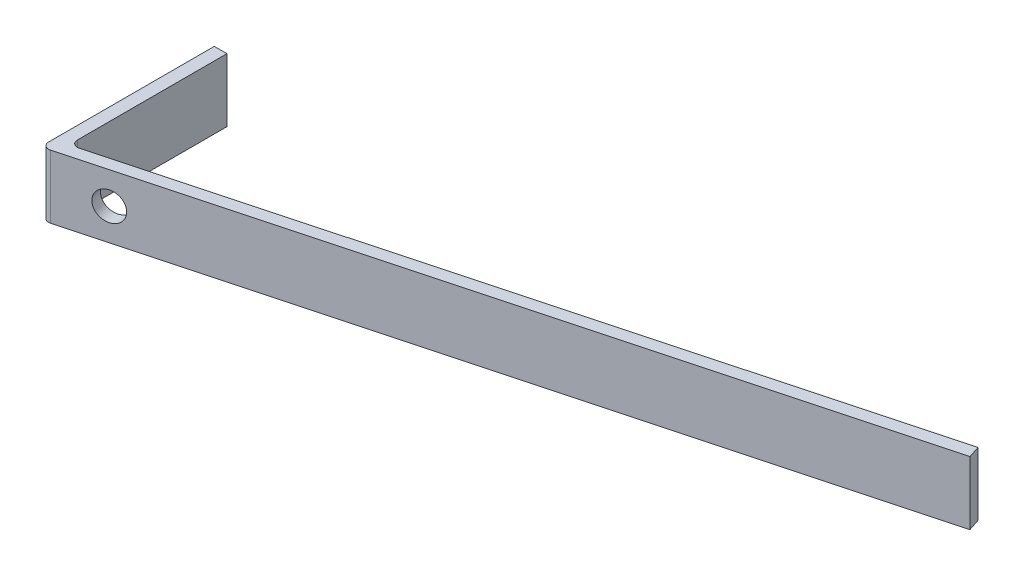
ISO-10303-21;
HEADER;
FILE_DESCRIPTION(('STEP AP214'),'2;1');
FILE_NAME('part.step','',(''),(''),'','','');
FILE_SCHEMA(('AUTOMOTIVE_DESIGN { 1 0 10303 214 1 1 1 1 }'));
ENDSEC;
DATA;
#1=APPLICATION_CONTEXT('core data for automotive mechanical design processes');
#2=APPLICATION_PROTOCOL_DEFINITION('international standard','automotive_design',2000,#1);
#3=PRODUCT_CONTEXT('',#1,'mechanical');
#4=PRODUCT('Part','Part','',(#3));
#5=PRODUCT_RELATED_PRODUCT_CATEGORY('part','',(#4));
#6=PRODUCT_DEFINITION_FORMATION('','',#4);
#7=PRODUCT_DEFINITION_CONTEXT('part definition',#1,'design');
#8=PRODUCT_DEFINITION('design','',#6,#7);
#9=PRODUCT_DEFINITION_SHAPE('','',#8);
#10=(LENGTH_UNIT() NAMED_UNIT(*) SI_UNIT(.MILLI.,.METRE.));
#11=(NAMED_UNIT(*) PLANE_ANGLE_UNIT() SI_UNIT($,.RADIAN.));
#12=(NAMED_UNIT(*) SI_UNIT($,.STERADIAN.) SOLID_ANGLE_UNIT());
#13=UNCERTAINTY_MEASURE_WITH_UNIT(LENGTH_MEASURE(1.E-05),#10,'distance_accuracy_value','');
#14=(GEOMETRIC_REPRESENTATION_CONTEXT(3) GLOBAL_UNCERTAINTY_ASSIGNED_CONTEXT((#13)) GLOBAL_UNIT_ASSIGNED_CONTEXT((#10,
#11,#12)) REPRESENTATION_CONTEXT('',''));
#15=CARTESIAN_POINT('',(0.,0.,0.));
#16=DIRECTION('',(0.,0.,1.));
#17=DIRECTION('',(1.,0.,0.));
#18=AXIS2_PLACEMENT_3D('',#15,#16,#17);
#19=CARTESIAN_POINT('',(0.,10.,0.));
#20=DIRECTION('',(1.,0.,0.));
#21=DIRECTION('',(0.,0.,-1.));
#22=AXIS2_PLACEMENT_3D('',#19,#20,#21);
#23=PLANE('',#22);
#24=DIRECTION('',(0.,0.,1.));
#25=VECTOR('',#24,1.);
#26=CARTESIAN_POINT('',(0.,0.,0.));
#27=LINE('',#26,#25);
#28=CARTESIAN_POINT('',(0.,0.,-27.5));
#29=VERTEX_POINT('',#28);
#30=CARTESIAN_POINT('',(0.,0.,-1.3032253728412));
#31=VERTEX_POINT('',#30);
#32=EDGE_CURVE('E123',#29,#31,#27,.T.);
#33=ORIENTED_EDGE('',*,*,#32,.T.);
#34=DIRECTION('',(0.,-1.,0.));
#35=VECTOR('',#34,1.);
#36=CARTESIAN_POINT('',(0.,10.,-1.3032253728412));
#37=LINE('',#36,#35);
#38=CARTESIAN_POINT('',(0.,10.,-1.3032253728412));
#39=VERTEX_POINT('',#38);
#40=EDGE_CURVE('E151',#31,#39,#37,.F.);
#41=ORIENTED_EDGE('',*,*,#40,.T.);
#42=DIRECTION('',(0.,0.,1.));
#43=VECTOR('',#42,1.);
#44=CARTESIAN_POINT('',(0.,10.,0.));
#45=LINE('',#44,#43);
#46=CARTESIAN_POINT('',(0.,10.,-27.5));
#47=VERTEX_POINT('',#46);
#48=EDGE_CURVE('E125',#47,#39,#45,.T.);
#49=ORIENTED_EDGE('',*,*,#48,.F.);
#50=DIRECTION('',(0.,-1.,0.));
#51=VECTOR('',#50,1.);
#52=CARTESIAN_POINT('',(0.,10.,-27.5));
#53=LINE('',#52,#51);
#54=EDGE_CURVE('E133',#47,#29,#53,.T.);
#55=ORIENTED_EDGE('',*,*,#54,.T.);
#56=EDGE_LOOP('',(#33,#41,#49,#55));
#57=FACE_BOUND('',#56,.T.);
#58=ADVANCED_FACE('F33',(#57),#23,.F.);
#59=CARTESIAN_POINT('',(0.,10.,0.));
#60=DIRECTION('',(-0.258819045102518,0.,-0.965925826289069));
#61=DIRECTION('',(-0.965925826289069,0.,0.258819045102518));
#62=AXIS2_PLACEMENT_3D('',#59,#60,#61);
#63=PLANE('',#62);
#64=CARTESIAN_POINT('',(8.59046727350434,5.,-2.30180876854145));
#65=DIRECTION('',(-0.258819045102518,0.,-0.965925826289069));
#66=DIRECTION('',(-0.965925826289069,0.,0.258819045102518));
#67=AXIS2_PLACEMENT_3D('',#64,#65,#66);
#68=ELLIPSE('',#67,2.25000033349179,2.25);
#69=CARTESIAN_POINT('',(6.41713384222561,5.,-1.71946583074676));
#70=VERTEX_POINT('',#69);
#71=EDGE_CURVE('E121',#70,#70,#68,.T.);
#72=ORIENTED_EDGE('',*,*,#71,.T.);
#73=EDGE_LOOP('',(#72));
#74=FACE_BOUND('',#73,.T.);
#75=DIRECTION('',(0.965925826289069,0.,-0.258819045102518));
#76=VECTOR('',#75,1.);
#77=CARTESIAN_POINT('',(0.,10.,0.));
#78=LINE('',#77,#76);
#79=CARTESIAN_POINT('',(1.25881904510252,10.,-0.337299546552133));
#80=VERTEX_POINT('',#79);
#81=CARTESIAN_POINT('',(115.911099154688,10.,-31.0582854123021));
#82=VERTEX_POINT('',#81);
#83=EDGE_CURVE('E114',#80,#82,#78,.T.);
#84=ORIENTED_EDGE('',*,*,#83,.F.);
#85=DIRECTION('',(0.,-1.,0.));
#86=VECTOR('',#85,1.);
#87=CARTESIAN_POINT('',(1.25881904510252,10.,-0.337299546552133));
#88=LINE('',#87,#86);
#89=CARTESIAN_POINT('',(1.25881904510252,0.,-0.337299546552133));
#90=VERTEX_POINT('',#89);
#91=EDGE_CURVE('E146',#80,#90,#88,.T.);
#92=ORIENTED_EDGE('',*,*,#91,.T.);
#93=DIRECTION('',(0.965925826289069,0.,-0.258819045102518));
#94=VECTOR('',#93,1.);
#95=CARTESIAN_POINT('',(0.,0.,0.));
#96=LINE('',#95,#94);
#97=CARTESIAN_POINT('',(115.911099154688,0.,-31.0582854123021));
#98=VERTEX_POINT('',#97);
#99=EDGE_CURVE('E136',#90,#98,#96,.T.);
#100=ORIENTED_EDGE('',*,*,#99,.T.);
#101=DIRECTION('',(0.,-1.,0.));
#102=VECTOR('',#101,1.);
#103=CARTESIAN_POINT('',(115.911099154688,10.,-31.0582854123021));
#104=LINE('',#103,#102);
#105=EDGE_CURVE('E109',#82,#98,#104,.T.);
#106=ORIENTED_EDGE('',*,*,#105,.F.);
#107=EDGE_LOOP('',(#84,#92,#100,#106));
#108=FACE_BOUND('',#107,.T.);
#109=ADVANCED_FACE('F181',(#74,#108),#63,.F.);
#110=CARTESIAN_POINT('',(2.,10.,-0.535898384862239));
#111=DIRECTION('',(-1.,0.,0.));
#112=DIRECTION('',(0.,0.,1.));
#113=AXIS2_PLACEMENT_3D('',#110,#111,#112);
#114=PLANE('',#113);
#115=DIRECTION('',(0.,0.,-1.));
#116=VECTOR('',#115,1.);
#117=CARTESIAN_POINT('',(2.,10.,-0.535898384862239));
#118=LINE('',#117,#116);
#119=CARTESIAN_POINT('',(2.,10.,-3.84102587555032));
#120=VERTEX_POINT('',#119);
#121=CARTESIAN_POINT('',(2.,10.,-27.5));
#122=VERTEX_POINT('',#121);
#123=EDGE_CURVE('E129',#120,#122,#118,.T.);
#124=ORIENTED_EDGE('',*,*,#123,.F.);
#125=DIRECTION('',(0.,-1.,0.));
#126=VECTOR('',#125,1.);
#127=CARTESIAN_POINT('',(2.,10.,-3.84102587555032));
#128=LINE('',#127,#126);
#129=CARTESIAN_POINT('',(2.,0.,-3.84102587555032));
#130=VERTEX_POINT('',#129);
#131=EDGE_CURVE('E155',#120,#130,#128,.T.);
#132=ORIENTED_EDGE('',*,*,#131,.T.);
#133=DIRECTION('',(0.,0.,-1.));
#134=VECTOR('',#133,1.);
#135=CARTESIAN_POINT('',(2.,0.,-0.535898384862239));
#136=LINE('',#135,#134);
#137=CARTESIAN_POINT('',(2.,0.,-27.5));
#138=VERTEX_POINT('',#137);
#139=EDGE_CURVE('E138',#130,#138,#136,.T.);
#140=ORIENTED_EDGE('',*,*,#139,.T.);
#141=DIRECTION('',(0.,-1.,0.));
#142=VECTOR('',#141,1.);
#143=CARTESIAN_POINT('',(2.,10.,-27.5));
#144=LINE('',#143,#142);
#145=EDGE_CURVE('E143',#122,#138,#144,.T.);
#146=ORIENTED_EDGE('',*,*,#145,.F.);
#147=EDGE_LOOP('',(#124,#132,#140,#146));
#148=FACE_BOUND('',#147,.T.);
#149=ADVANCED_FACE('F166',(#148),#114,.F.);
#150=CARTESIAN_POINT('',(0.,10.,-27.5));
#151=DIRECTION('',(0.,0.,1.));
#152=DIRECTION('',(1.,0.,0.));
#153=AXIS2_PLACEMENT_3D('',#150,#151,#152);
#154=PLANE('',#153);
#155=DIRECTION('',(-1.,0.,0.));
#156=VECTOR('',#155,1.);
#157=CARTESIAN_POINT('',(0.,0.,-27.5));
#158=LINE('',#157,#156);
#159=EDGE_CURVE('E127',#138,#29,#158,.T.);
#160=ORIENTED_EDGE('',*,*,#159,.T.);
#161=ORIENTED_EDGE('',*,*,#54,.F.);
#162=DIRECTION('',(-1.,0.,0.));
#163=VECTOR('',#162,1.);
#164=CARTESIAN_POINT('',(0.,10.,-27.5));
#165=LINE('',#164,#163);
#166=EDGE_CURVE('E131',#122,#47,#165,.T.);
#167=ORIENTED_EDGE('',*,*,#166,.F.);
#168=ORIENTED_EDGE('',*,*,#145,.T.);
#169=EDGE_LOOP('',(#160,#161,#167,#168));
#170=FACE_BOUND('',#169,.T.);
#171=ADVANCED_FACE('F173',(#170),#154,.F.);
#172=CARTESIAN_POINT('',(0.,10.,0.));
#173=DIRECTION('',(0.,-1.,0.));
#174=DIRECTION('',(0.,0.,-1.));
#175=AXIS2_PLACEMENT_3D('',#172,#173,#174);
#176=PLANE('',#175);
#177=ORIENTED_EDGE('',*,*,#48,.T.);
#178=CARTESIAN_POINT('',(1.,10.,-1.3032253728412));
#179=DIRECTION('',(0.,-1.,0.));
#180=DIRECTION('',(0.,0.,-1.));
#181=AXIS2_PLACEMENT_3D('',#178,#179,#180);
#182=CIRCLE('',#181,1.);
#183=EDGE_CURVE('E153',#39,#80,#182,.F.);
#184=ORIENTED_EDGE('',*,*,#183,.T.);
#185=ORIENTED_EDGE('',*,*,#83,.T.);
#186=DIRECTION('',(0.312653943920722,0.,0.949867101941539));
#187=VECTOR('',#186,1.);
#188=CARTESIAN_POINT('',(115.285791266847,10.,-32.9580196161852));
#189=LINE('',#188,#187);
#190=CARTESIAN_POINT('',(115.285791266847,10.,-32.9580196161852));
#191=VERTEX_POINT('',#190);
#192=EDGE_CURVE('E101',#191,#82,#189,.T.);
#193=ORIENTED_EDGE('',*,*,#192,.F.);
#194=DIRECTION('',(0.965784766411818,0.,-0.259344915058826));
#195=VECTOR('',#194,1.);
#196=CARTESIAN_POINT('',(0.,10.,-2.));
#197=LINE('',#196,#195);
#198=CARTESIAN_POINT('',(3.25934491505883,10.,-2.8752411091385));
#199=VERTEX_POINT('',#198);
#200=EDGE_CURVE('E95',#199,#191,#197,.T.);
#201=ORIENTED_EDGE('',*,*,#200,.F.);
#202=CARTESIAN_POINT('',(3.,10.,-3.84102587555032));
#203=DIRECTION('',(0.,-1.,0.));
#204=DIRECTION('',(0.,0.,-1.));
#205=AXIS2_PLACEMENT_3D('',#202,#203,#204);
#206=CIRCLE('',#205,1.);
#207=EDGE_CURVE('E11',#199,#120,#206,.T.);
#208=ORIENTED_EDGE('',*,*,#207,.T.);
#209=ORIENTED_EDGE('',*,*,#123,.T.);
#210=ORIENTED_EDGE('',*,*,#166,.T.);
#211=EDGE_LOOP('',(#177,#184,#185,#193,#201,#208,#209,#210));
#212=FACE_BOUND('',#211,.T.);
#213=ADVANCED_FACE('F112',(#212),#176,.F.);
#214=CARTESIAN_POINT('',(0.,0.,0.));
#215=DIRECTION('',(0.,-1.,0.));
#216=DIRECTION('',(0.,0.,-1.));
#217=AXIS2_PLACEMENT_3D('',#214,#215,#216);
#218=PLANE('',#217);
#219=ORIENTED_EDGE('',*,*,#99,.F.);
#220=CARTESIAN_POINT('',(1.,0.,-1.3032253728412));
#221=DIRECTION('',(0.,-1.,0.));
#222=DIRECTION('',(0.,0.,-1.));
#223=AXIS2_PLACEMENT_3D('',#220,#221,#222);
#224=CIRCLE('',#223,1.);
#225=EDGE_CURVE('E149',#90,#31,#224,.T.);
#226=ORIENTED_EDGE('',*,*,#225,.T.);
#227=ORIENTED_EDGE('',*,*,#32,.F.);
#228=ORIENTED_EDGE('',*,*,#159,.F.);
#229=ORIENTED_EDGE('',*,*,#139,.F.);
#230=CARTESIAN_POINT('',(3.,0.,-3.84102587555032));
#231=DIRECTION('',(0.,-1.,0.));
#232=DIRECTION('',(0.,0.,-1.));
#233=AXIS2_PLACEMENT_3D('',#230,#231,#232);
#234=CIRCLE('',#233,1.);
#235=CARTESIAN_POINT('',(3.25934491505883,0.,-2.8752411091385));
#236=VERTEX_POINT('',#235);
#237=EDGE_CURVE('E41',#130,#236,#234,.F.);
#238=ORIENTED_EDGE('',*,*,#237,.T.);
#239=DIRECTION('',(0.965784766411818,0.,-0.259344915058826));
#240=VECTOR('',#239,1.);
#241=CARTESIAN_POINT('',(0.,0.,-2.));
#242=LINE('',#241,#240);
#243=CARTESIAN_POINT('',(115.285791266847,0.,-32.9580196161852));
#244=VERTEX_POINT('',#243);
#245=EDGE_CURVE('E119',#236,#244,#242,.T.);
#246=ORIENTED_EDGE('',*,*,#245,.T.);
#247=DIRECTION('',(0.312653943920722,0.,0.949867101941539));
#248=VECTOR('',#247,1.);
#249=CARTESIAN_POINT('',(115.285791266847,0.,-32.9580196161852));
#250=LINE('',#249,#248);
#251=EDGE_CURVE('E102',#244,#98,#250,.T.);
#252=ORIENTED_EDGE('',*,*,#251,.T.);
#253=EDGE_LOOP('',(#219,#226,#227,#228,#229,#238,#246,#252));
#254=FACE_BOUND('',#253,.T.);
#255=ADVANCED_FACE('F161',(#254),#218,.T.);
#256=CARTESIAN_POINT('',(0.,10.,-2.));
#257=DIRECTION('',(-0.259344915058826,0.,-0.965784766411818));
#258=DIRECTION('',(-0.965784766411818,0.,0.259344915058826));
#259=AXIS2_PLACEMENT_3D('',#256,#257,#258);
#260=PLANE('',#259);
#261=CARTESIAN_POINT('',(8.08826874711792,5.,-4.17196568443263));
#262=DIRECTION('',(-0.259344915058826,0.,-0.965784766411818));
#263=DIRECTION('',(-0.965784766411818,0.,0.259344915058826));
#264=AXIS2_PLACEMENT_3D('',#261,#262,#263);
#265=CIRCLE('',#264,2.25);
#266=CARTESIAN_POINT('',(5.91525302269132,5.,-3.58843962555027));
#267=VERTEX_POINT('',#266);
#268=EDGE_CURVE('E285',#267,#267,#265,.T.);
#269=ORIENTED_EDGE('',*,*,#268,.F.);
#270=EDGE_LOOP('',(#269));
#271=FACE_BOUND('',#270,.T.);
#272=ORIENTED_EDGE('',*,*,#245,.F.);
#273=DIRECTION('',(0.,-1.,0.));
#274=VECTOR('',#273,1.);
#275=CARTESIAN_POINT('',(3.25934491505883,10.,-2.8752411091385));
#276=LINE('',#275,#274);
#277=EDGE_CURVE('E54',#236,#199,#276,.F.);
#278=ORIENTED_EDGE('',*,*,#277,.T.);
#279=ORIENTED_EDGE('',*,*,#200,.T.);
#280=DIRECTION('',(0.,-1.,0.));
#281=VECTOR('',#280,1.);
#282=CARTESIAN_POINT('',(115.285791266847,10.,-32.9580196161852));
#283=LINE('',#282,#281);
#284=EDGE_CURVE('E98',#191,#244,#283,.T.);
#285=ORIENTED_EDGE('',*,*,#284,.T.);
#286=EDGE_LOOP('',(#272,#278,#279,#285));
#287=FACE_BOUND('',#286,.T.);
#288=ADVANCED_FACE('F97',(#271,#287),#260,.T.);
#289=CARTESIAN_POINT('',(115.285791266847,10.,-32.9580196161852));
#290=DIRECTION('',(0.949867101941539,0.,-0.312653943920722));
#291=DIRECTION('',(-0.312653943920722,0.,-0.949867101941539));
#292=AXIS2_PLACEMENT_3D('',#289,#290,#291);
#293=PLANE('',#292);
#294=ORIENTED_EDGE('',*,*,#251,.F.);
#295=ORIENTED_EDGE('',*,*,#284,.F.);
#296=ORIENTED_EDGE('',*,*,#192,.T.);
#297=ORIENTED_EDGE('',*,*,#105,.T.);
#298=EDGE_LOOP('',(#294,#295,#296,#297));
#299=FACE_BOUND('',#298,.T.);
#300=ADVANCED_FACE('F106',(#299),#293,.T.);
#301=CARTESIAN_POINT('',(1.,10.,-1.3032253728412));
#302=DIRECTION('',(0.,-1.,0.));
#303=DIRECTION('',(0.,0.,-1.));
#304=AXIS2_PLACEMENT_3D('',#301,#302,#303);
#305=CYLINDRICAL_SURFACE('',#304,1.);
#306=ORIENTED_EDGE('',*,*,#183,.F.);
#307=ORIENTED_EDGE('',*,*,#40,.F.);
#308=ORIENTED_EDGE('',*,*,#225,.F.);
#309=ORIENTED_EDGE('',*,*,#91,.F.);
#310=EDGE_LOOP('',(#306,#307,#308,#309));
#311=FACE_BOUND('',#310,.T.);
#312=ADVANCED_FACE('F178',(#311),#305,.T.);
#313=CARTESIAN_POINT('',(3.,10.,-3.84102587555032));
#314=DIRECTION('',(0.,-1.,0.));
#315=DIRECTION('',(0.,0.,-1.));
#316=AXIS2_PLACEMENT_3D('',#313,#314,#315);
#317=CYLINDRICAL_SURFACE('',#316,1.);
#318=ORIENTED_EDGE('',*,*,#207,.F.);
#319=ORIENTED_EDGE('',*,*,#277,.F.);
#320=ORIENTED_EDGE('',*,*,#237,.F.);
#321=ORIENTED_EDGE('',*,*,#131,.F.);
#322=EDGE_LOOP('',(#318,#319,#320,#321));
#323=FACE_BOUND('',#322,.T.);
#324=ADVANCED_FACE('F35',(#323),#317,.F.);
#325=CARTESIAN_POINT('',(10.6817178977062,5.,5.48588197968556));
#326=DIRECTION('',(-0.259344915058826,0.,-0.965784766411818));
#327=DIRECTION('',(-0.965784766411818,0.,0.259344915058826));
#328=AXIS2_PLACEMENT_3D('',#325,#326,#327);
#329=CYLINDRICAL_SURFACE('',#328,2.25);
#330=ORIENTED_EDGE('',*,*,#268,.T.);
#331=EDGE_LOOP('',(#330));
#332=FACE_BOUND('',#331,.T.);
#333=ORIENTED_EDGE('',*,*,#71,.F.);
#334=EDGE_LOOP('',(#333));
#335=FACE_BOUND('',#334,.T.);
#336=ADVANCED_FACE('F198',(#332,#335),#329,.F.);
#337=CLOSED_SHELL('',(#58,#109,#149,#171,#213,#255,#288,#300,#312,#324,#336));
#338=MANIFOLD_SOLID_BREP('B2',#337);
#339=ADVANCED_BREP_SHAPE_REPRESENTATION('',(#18,#338),#14);
#340=SHAPE_DEFINITION_REPRESENTATION(#9,#339);
ENDSEC;
END-ISO-10303-21;
